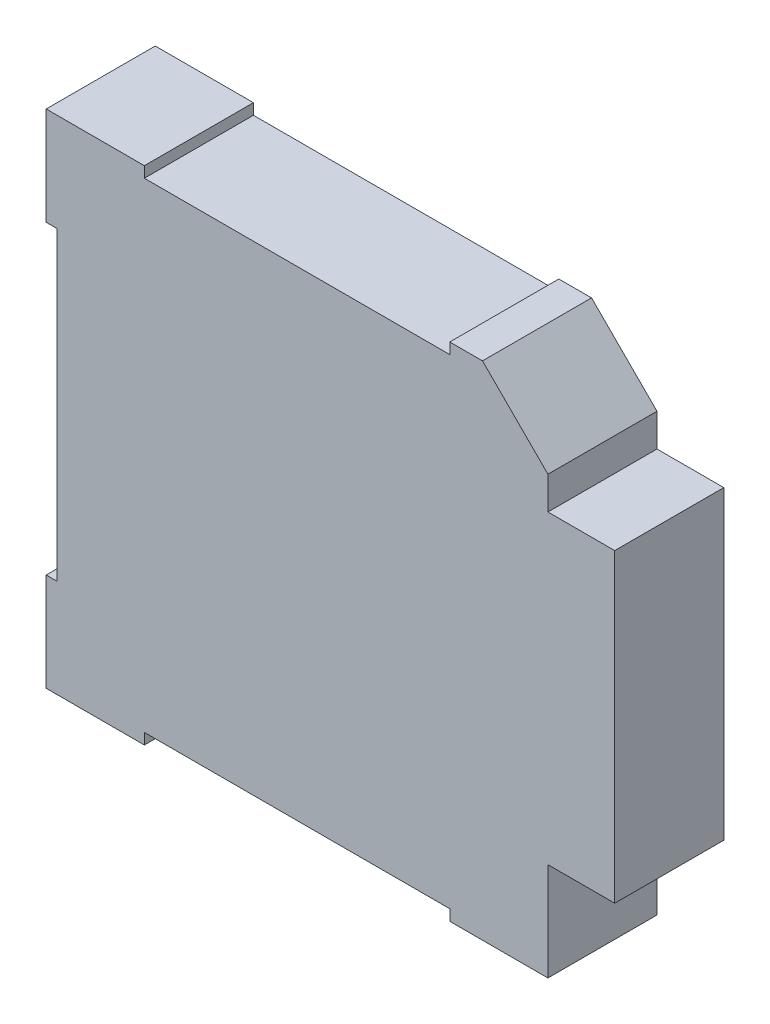
ISO-10303-21;
HEADER;
FILE_DESCRIPTION(('STEP AP214'),'2;1');
FILE_NAME('part.step','',(''),(''),'','','');
FILE_SCHEMA(('AUTOMOTIVE_DESIGN { 1 0 10303 214 1 1 1 1 }'));
ENDSEC;
DATA;
#1=APPLICATION_CONTEXT('core data for automotive mechanical design processes');
#2=APPLICATION_PROTOCOL_DEFINITION('international standard','automotive_design',2000,#1);
#3=PRODUCT_CONTEXT('',#1,'mechanical');
#4=PRODUCT('Part','Part','',(#3));
#5=PRODUCT_RELATED_PRODUCT_CATEGORY('part','',(#4));
#6=PRODUCT_DEFINITION_FORMATION('','',#4);
#7=PRODUCT_DEFINITION_CONTEXT('part definition',#1,'design');
#8=PRODUCT_DEFINITION('design','',#6,#7);
#9=PRODUCT_DEFINITION_SHAPE('','',#8);
#10=(LENGTH_UNIT() NAMED_UNIT(*) SI_UNIT(.MILLI.,.METRE.));
#11=(NAMED_UNIT(*) PLANE_ANGLE_UNIT() SI_UNIT($,.RADIAN.));
#12=(NAMED_UNIT(*) SI_UNIT($,.STERADIAN.) SOLID_ANGLE_UNIT());
#13=UNCERTAINTY_MEASURE_WITH_UNIT(LENGTH_MEASURE(1.E-05),#10,'distance_accuracy_value','');
#14=(GEOMETRIC_REPRESENTATION_CONTEXT(3) GLOBAL_UNCERTAINTY_ASSIGNED_CONTEXT((#13)) GLOBAL_UNIT_ASSIGNED_CONTEXT((#10,
#11,#12)) REPRESENTATION_CONTEXT('',''));
#15=CARTESIAN_POINT('',(0.,0.,0.));
#16=DIRECTION('',(0.,0.,1.));
#17=DIRECTION('',(1.,0.,0.));
#18=AXIS2_PLACEMENT_3D('',#15,#16,#17);
#19=CARTESIAN_POINT('',(2.8,-4.6,2.));
#20=DIRECTION('',(0.,1.,0.));
#21=DIRECTION('',(0.,0.,1.));
#22=AXIS2_PLACEMENT_3D('',#19,#20,#21);
#23=PLANE('',#22);
#24=DIRECTION('',(1.,0.,0.));
#25=VECTOR('',#24,1.);
#26=CARTESIAN_POINT('',(2.8,-4.6,0.));
#27=LINE('',#26,#25);
#28=CARTESIAN_POINT('',(2.8,-4.6,0.));
#29=VERTEX_POINT('',#28);
#30=CARTESIAN_POINT('',(4.6,-4.6,0.));
#31=VERTEX_POINT('',#30);
#32=EDGE_CURVE('E208',#29,#31,#27,.T.);
#33=ORIENTED_EDGE('',*,*,#32,.T.);
#34=DIRECTION('',(0.,0.,-1.));
#35=VECTOR('',#34,1.);
#36=CARTESIAN_POINT('',(4.6,-4.6,2.));
#37=LINE('',#36,#35);
#38=CARTESIAN_POINT('',(4.6,-4.6,2.));
#39=VERTEX_POINT('',#38);
#40=EDGE_CURVE('E11',#39,#31,#37,.T.);
#41=ORIENTED_EDGE('',*,*,#40,.F.);
#42=DIRECTION('',(1.,0.,0.));
#43=VECTOR('',#42,1.);
#44=CARTESIAN_POINT('',(2.8,-4.6,2.));
#45=LINE('',#44,#43);
#46=CARTESIAN_POINT('',(2.8,-4.6,2.));
#47=VERTEX_POINT('',#46);
#48=EDGE_CURVE('E248',#47,#39,#45,.T.);
#49=ORIENTED_EDGE('',*,*,#48,.F.);
#50=DIRECTION('',(0.,0.,-1.));
#51=VECTOR('',#50,1.);
#52=CARTESIAN_POINT('',(2.8,-4.6,2.));
#53=LINE('',#52,#51);
#54=EDGE_CURVE('E204',#47,#29,#53,.T.);
#55=ORIENTED_EDGE('',*,*,#54,.T.);
#56=EDGE_LOOP('',(#33,#41,#49,#55));
#57=FACE_BOUND('',#56,.T.);
#58=ADVANCED_FACE('F34',(#57),#23,.F.);
#59=CARTESIAN_POINT('',(4.6,-4.6,2.));
#60=DIRECTION('',(-1.,0.,0.));
#61=DIRECTION('',(0.,0.,1.));
#62=AXIS2_PLACEMENT_3D('',#59,#60,#61);
#63=PLANE('',#62);
#64=DIRECTION('',(0.,1.,0.));
#65=VECTOR('',#64,1.);
#66=CARTESIAN_POINT('',(4.6,-4.6,0.));
#67=LINE('',#66,#65);
#68=CARTESIAN_POINT('',(4.6,-2.8,0.));
#69=VERTEX_POINT('',#68);
#70=EDGE_CURVE('E211',#31,#69,#67,.T.);
#71=ORIENTED_EDGE('',*,*,#70,.T.);
#72=DIRECTION('',(0.,0.,-1.));
#73=VECTOR('',#72,1.);
#74=CARTESIAN_POINT('',(4.6,-2.8,2.));
#75=LINE('',#74,#73);
#76=CARTESIAN_POINT('',(4.6,-2.8,2.));
#77=VERTEX_POINT('',#76);
#78=EDGE_CURVE('E42',#77,#69,#75,.T.);
#79=ORIENTED_EDGE('',*,*,#78,.F.);
#80=DIRECTION('',(0.,1.,0.));
#81=VECTOR('',#80,1.);
#82=CARTESIAN_POINT('',(4.6,-4.6,2.));
#83=LINE('',#82,#81);
#84=EDGE_CURVE('E132',#39,#77,#83,.T.);
#85=ORIENTED_EDGE('',*,*,#84,.F.);
#86=ORIENTED_EDGE('',*,*,#40,.T.);
#87=EDGE_LOOP('',(#71,#79,#85,#86));
#88=FACE_BOUND('',#87,.T.);
#89=ADVANCED_FACE('F371',(#88),#63,.F.);
#90=CARTESIAN_POINT('',(4.6,-2.8,2.));
#91=DIRECTION('',(0.,1.,0.));
#92=DIRECTION('',(0.,0.,1.));
#93=AXIS2_PLACEMENT_3D('',#90,#91,#92);
#94=PLANE('',#93);
#95=DIRECTION('',(1.,0.,0.));
#96=VECTOR('',#95,1.);
#97=CARTESIAN_POINT('',(4.6,-2.8,0.));
#98=LINE('',#97,#96);
#99=CARTESIAN_POINT('',(5.825,-2.8,0.));
#100=VERTEX_POINT('',#99);
#101=EDGE_CURVE('E213',#69,#100,#98,.T.);
#102=ORIENTED_EDGE('',*,*,#101,.T.);
#103=DIRECTION('',(0.,0.,-1.));
#104=VECTOR('',#103,1.);
#105=CARTESIAN_POINT('',(5.825,-2.8,2.));
#106=LINE('',#105,#104);
#107=CARTESIAN_POINT('',(5.825,-2.8,2.));
#108=VERTEX_POINT('',#107);
#109=EDGE_CURVE('E294',#108,#100,#106,.T.);
#110=ORIENTED_EDGE('',*,*,#109,.F.);
#111=DIRECTION('',(1.,0.,0.));
#112=VECTOR('',#111,1.);
#113=CARTESIAN_POINT('',(4.6,-2.8,2.));
#114=LINE('',#113,#112);
#115=EDGE_CURVE('E302',#77,#108,#114,.T.);
#116=ORIENTED_EDGE('',*,*,#115,.F.);
#117=ORIENTED_EDGE('',*,*,#78,.T.);
#118=EDGE_LOOP('',(#102,#110,#116,#117));
#119=FACE_BOUND('',#118,.T.);
#120=ADVANCED_FACE('F300',(#119),#94,.F.);
#121=CARTESIAN_POINT('',(5.825,-2.8,2.));
#122=DIRECTION('',(-1.,0.,0.));
#123=DIRECTION('',(0.,0.,1.));
#124=AXIS2_PLACEMENT_3D('',#121,#122,#123);
#125=PLANE('',#124);
#126=DIRECTION('',(0.,1.,0.));
#127=VECTOR('',#126,1.);
#128=CARTESIAN_POINT('',(5.825,-2.8,0.));
#129=LINE('',#128,#127);
#130=CARTESIAN_POINT('',(5.825,2.8,0.));
#131=VERTEX_POINT('',#130);
#132=EDGE_CURVE('E215',#100,#131,#129,.T.);
#133=ORIENTED_EDGE('',*,*,#132,.T.);
#134=DIRECTION('',(0.,0.,-1.));
#135=VECTOR('',#134,1.);
#136=CARTESIAN_POINT('',(5.825,2.8,2.));
#137=LINE('',#136,#135);
#138=CARTESIAN_POINT('',(5.825,2.8,2.));
#139=VERTEX_POINT('',#138);
#140=EDGE_CURVE('E291',#139,#131,#137,.T.);
#141=ORIENTED_EDGE('',*,*,#140,.F.);
#142=DIRECTION('',(0.,1.,0.));
#143=VECTOR('',#142,1.);
#144=CARTESIAN_POINT('',(5.825,-2.8,2.));
#145=LINE('',#144,#143);
#146=EDGE_CURVE('E320',#108,#139,#145,.T.);
#147=ORIENTED_EDGE('',*,*,#146,.F.);
#148=ORIENTED_EDGE('',*,*,#109,.T.);
#149=EDGE_LOOP('',(#133,#141,#147,#148));
#150=FACE_BOUND('',#149,.T.);
#151=ADVANCED_FACE('F311',(#150),#125,.F.);
#152=CARTESIAN_POINT('',(5.825,2.8,2.));
#153=DIRECTION('',(0.,-1.,0.));
#154=DIRECTION('',(0.,0.,-1.));
#155=AXIS2_PLACEMENT_3D('',#152,#153,#154);
#156=PLANE('',#155);
#157=DIRECTION('',(-1.,0.,0.));
#158=VECTOR('',#157,1.);
#159=CARTESIAN_POINT('',(5.825,2.8,0.));
#160=LINE('',#159,#158);
#161=CARTESIAN_POINT('',(4.6,2.8,0.));
#162=VERTEX_POINT('',#161);
#163=EDGE_CURVE('E217',#131,#162,#160,.T.);
#164=ORIENTED_EDGE('',*,*,#163,.T.);
#165=DIRECTION('',(0.,0.,-1.));
#166=VECTOR('',#165,1.);
#167=CARTESIAN_POINT('',(4.6,2.8,2.));
#168=LINE('',#167,#166);
#169=CARTESIAN_POINT('',(4.6,2.8,2.));
#170=VERTEX_POINT('',#169);
#171=EDGE_CURVE('E288',#170,#162,#168,.T.);
#172=ORIENTED_EDGE('',*,*,#171,.F.);
#173=DIRECTION('',(-1.,0.,0.));
#174=VECTOR('',#173,1.);
#175=CARTESIAN_POINT('',(5.825,2.8,2.));
#176=LINE('',#175,#174);
#177=EDGE_CURVE('E317',#139,#170,#176,.T.);
#178=ORIENTED_EDGE('',*,*,#177,.F.);
#179=ORIENTED_EDGE('',*,*,#140,.T.);
#180=EDGE_LOOP('',(#164,#172,#178,#179));
#181=FACE_BOUND('',#180,.T.);
#182=ADVANCED_FACE('F315',(#181),#156,.F.);
#183=CARTESIAN_POINT('',(4.6,2.8,2.));
#184=DIRECTION('',(-1.,0.,0.));
#185=DIRECTION('',(0.,0.,1.));
#186=AXIS2_PLACEMENT_3D('',#183,#184,#185);
#187=PLANE('',#186);
#188=DIRECTION('',(0.,1.,0.));
#189=VECTOR('',#188,1.);
#190=CARTESIAN_POINT('',(4.6,2.8,0.));
#191=LINE('',#190,#189);
#192=CARTESIAN_POINT('',(4.6,3.4,0.));
#193=VERTEX_POINT('',#192);
#194=EDGE_CURVE('E219',#162,#193,#191,.T.);
#195=ORIENTED_EDGE('',*,*,#194,.T.);
#196=DIRECTION('',(0.,0.,-1.));
#197=VECTOR('',#196,1.);
#198=CARTESIAN_POINT('',(4.6,3.4,2.));
#199=LINE('',#198,#197);
#200=CARTESIAN_POINT('',(4.6,3.4,2.));
#201=VERTEX_POINT('',#200);
#202=EDGE_CURVE('E285',#201,#193,#199,.T.);
#203=ORIENTED_EDGE('',*,*,#202,.F.);
#204=DIRECTION('',(0.,1.,0.));
#205=VECTOR('',#204,1.);
#206=CARTESIAN_POINT('',(4.6,2.8,2.));
#207=LINE('',#206,#205);
#208=EDGE_CURVE('E319',#170,#201,#207,.T.);
#209=ORIENTED_EDGE('',*,*,#208,.F.);
#210=ORIENTED_EDGE('',*,*,#171,.T.);
#211=EDGE_LOOP('',(#195,#203,#209,#210));
#212=FACE_BOUND('',#211,.T.);
#213=ADVANCED_FACE('F384',(#212),#187,.F.);
#214=CARTESIAN_POINT('',(4.6,3.4,2.));
#215=DIRECTION('',(-0.707106781186547,-0.707106781186547,0.));
#216=DIRECTION('',(0.707106781186548,-0.707106781186548,0.));
#217=AXIS2_PLACEMENT_3D('',#214,#215,#216);
#218=PLANE('',#217);
#219=DIRECTION('',(-0.707106781186547,0.707106781186547,0.));
#220=VECTOR('',#219,1.);
#221=CARTESIAN_POINT('',(4.6,3.4,0.));
#222=LINE('',#221,#220);
#223=CARTESIAN_POINT('',(3.4,4.6,0.));
#224=VERTEX_POINT('',#223);
#225=EDGE_CURVE('E221',#193,#224,#222,.T.);
#226=ORIENTED_EDGE('',*,*,#225,.T.);
#227=DIRECTION('',(0.,0.,-1.));
#228=VECTOR('',#227,1.);
#229=CARTESIAN_POINT('',(3.4,4.6,2.));
#230=LINE('',#229,#228);
#231=CARTESIAN_POINT('',(3.4,4.6,2.));
#232=VERTEX_POINT('',#231);
#233=EDGE_CURVE('E282',#232,#224,#230,.T.);
#234=ORIENTED_EDGE('',*,*,#233,.F.);
#235=DIRECTION('',(-0.707106781186547,0.707106781186547,0.));
#236=VECTOR('',#235,1.);
#237=CARTESIAN_POINT('',(4.6,3.4,2.));
#238=LINE('',#237,#236);
#239=EDGE_CURVE('E322',#201,#232,#238,.T.);
#240=ORIENTED_EDGE('',*,*,#239,.F.);
#241=ORIENTED_EDGE('',*,*,#202,.T.);
#242=EDGE_LOOP('',(#226,#234,#240,#241));
#243=FACE_BOUND('',#242,.T.);
#244=ADVANCED_FACE('F387',(#243),#218,.F.);
#245=CARTESIAN_POINT('',(3.4,4.6,2.));
#246=DIRECTION('',(0.,-1.,0.));
#247=DIRECTION('',(0.,0.,-1.));
#248=AXIS2_PLACEMENT_3D('',#245,#246,#247);
#249=PLANE('',#248);
#250=DIRECTION('',(-1.,0.,0.));
#251=VECTOR('',#250,1.);
#252=CARTESIAN_POINT('',(3.4,4.6,0.));
#253=LINE('',#252,#251);
#254=CARTESIAN_POINT('',(2.8,4.6,0.));
#255=VERTEX_POINT('',#254);
#256=EDGE_CURVE('E223',#224,#255,#253,.T.);
#257=ORIENTED_EDGE('',*,*,#256,.T.);
#258=DIRECTION('',(0.,0.,-1.));
#259=VECTOR('',#258,1.);
#260=CARTESIAN_POINT('',(2.8,4.6,2.));
#261=LINE('',#260,#259);
#262=CARTESIAN_POINT('',(2.8,4.6,2.));
#263=VERTEX_POINT('',#262);
#264=EDGE_CURVE('E279',#263,#255,#261,.T.);
#265=ORIENTED_EDGE('',*,*,#264,.F.);
#266=DIRECTION('',(-1.,0.,0.));
#267=VECTOR('',#266,1.);
#268=CARTESIAN_POINT('',(3.4,4.6,2.));
#269=LINE('',#268,#267);
#270=EDGE_CURVE('E328',#232,#263,#269,.T.);
#271=ORIENTED_EDGE('',*,*,#270,.F.);
#272=ORIENTED_EDGE('',*,*,#233,.T.);
#273=EDGE_LOOP('',(#257,#265,#271,#272));
#274=FACE_BOUND('',#273,.T.);
#275=ADVANCED_FACE('F391',(#274),#249,.F.);
#276=CARTESIAN_POINT('',(2.8,4.6,2.));
#277=DIRECTION('',(1.,0.,0.));
#278=DIRECTION('',(0.,0.,-1.));
#279=AXIS2_PLACEMENT_3D('',#276,#277,#278);
#280=PLANE('',#279);
#281=DIRECTION('',(0.,-1.,0.));
#282=VECTOR('',#281,1.);
#283=CARTESIAN_POINT('',(2.8,4.6,0.));
#284=LINE('',#283,#282);
#285=CARTESIAN_POINT('',(2.8,4.4,0.));
#286=VERTEX_POINT('',#285);
#287=EDGE_CURVE('E225',#255,#286,#284,.T.);
#288=ORIENTED_EDGE('',*,*,#287,.T.);
#289=DIRECTION('',(0.,0.,-1.));
#290=VECTOR('',#289,1.);
#291=CARTESIAN_POINT('',(2.8,4.4,2.));
#292=LINE('',#291,#290);
#293=CARTESIAN_POINT('',(2.8,4.4,2.));
#294=VERTEX_POINT('',#293);
#295=EDGE_CURVE('E276',#294,#286,#292,.T.);
#296=ORIENTED_EDGE('',*,*,#295,.F.);
#297=DIRECTION('',(0.,-1.,0.));
#298=VECTOR('',#297,1.);
#299=CARTESIAN_POINT('',(2.8,4.6,2.));
#300=LINE('',#299,#298);
#301=EDGE_CURVE('E330',#263,#294,#300,.T.);
#302=ORIENTED_EDGE('',*,*,#301,.F.);
#303=ORIENTED_EDGE('',*,*,#264,.T.);
#304=EDGE_LOOP('',(#288,#296,#302,#303));
#305=FACE_BOUND('',#304,.T.);
#306=ADVANCED_FACE('F395',(#305),#280,.F.);
#307=CARTESIAN_POINT('',(2.8,4.4,2.));
#308=DIRECTION('',(0.,-1.,0.));
#309=DIRECTION('',(0.,0.,-1.));
#310=AXIS2_PLACEMENT_3D('',#307,#308,#309);
#311=PLANE('',#310);
#312=DIRECTION('',(-1.,0.,0.));
#313=VECTOR('',#312,1.);
#314=CARTESIAN_POINT('',(2.8,4.4,0.));
#315=LINE('',#314,#313);
#316=CARTESIAN_POINT('',(-2.8,4.4,0.));
#317=VERTEX_POINT('',#316);
#318=EDGE_CURVE('E227',#286,#317,#315,.T.);
#319=ORIENTED_EDGE('',*,*,#318,.T.);
#320=DIRECTION('',(0.,0.,-1.));
#321=VECTOR('',#320,1.);
#322=CARTESIAN_POINT('',(-2.8,4.4,2.));
#323=LINE('',#322,#321);
#324=CARTESIAN_POINT('',(-2.8,4.4,2.));
#325=VERTEX_POINT('',#324);
#326=EDGE_CURVE('E273',#325,#317,#323,.T.);
#327=ORIENTED_EDGE('',*,*,#326,.F.);
#328=DIRECTION('',(-1.,0.,0.));
#329=VECTOR('',#328,1.);
#330=CARTESIAN_POINT('',(2.8,4.4,2.));
#331=LINE('',#330,#329);
#332=EDGE_CURVE('E332',#294,#325,#331,.T.);
#333=ORIENTED_EDGE('',*,*,#332,.F.);
#334=ORIENTED_EDGE('',*,*,#295,.T.);
#335=EDGE_LOOP('',(#319,#327,#333,#334));
#336=FACE_BOUND('',#335,.T.);
#337=ADVANCED_FACE('F399',(#336),#311,.F.);
#338=CARTESIAN_POINT('',(-2.8,4.4,2.));
#339=DIRECTION('',(-1.,0.,0.));
#340=DIRECTION('',(0.,0.,1.));
#341=AXIS2_PLACEMENT_3D('',#338,#339,#340);
#342=PLANE('',#341);
#343=DIRECTION('',(0.,1.,0.));
#344=VECTOR('',#343,1.);
#345=CARTESIAN_POINT('',(-2.8,4.4,0.));
#346=LINE('',#345,#344);
#347=CARTESIAN_POINT('',(-2.8,4.6,0.));
#348=VERTEX_POINT('',#347);
#349=EDGE_CURVE('E229',#317,#348,#346,.T.);
#350=ORIENTED_EDGE('',*,*,#349,.T.);
#351=DIRECTION('',(0.,0.,-1.));
#352=VECTOR('',#351,1.);
#353=CARTESIAN_POINT('',(-2.8,4.6,2.));
#354=LINE('',#353,#352);
#355=CARTESIAN_POINT('',(-2.8,4.6,2.));
#356=VERTEX_POINT('',#355);
#357=EDGE_CURVE('E270',#356,#348,#354,.T.);
#358=ORIENTED_EDGE('',*,*,#357,.F.);
#359=DIRECTION('',(0.,1.,0.));
#360=VECTOR('',#359,1.);
#361=CARTESIAN_POINT('',(-2.8,4.4,2.));
#362=LINE('',#361,#360);
#363=EDGE_CURVE('E334',#325,#356,#362,.T.);
#364=ORIENTED_EDGE('',*,*,#363,.F.);
#365=ORIENTED_EDGE('',*,*,#326,.T.);
#366=EDGE_LOOP('',(#350,#358,#364,#365));
#367=FACE_BOUND('',#366,.T.);
#368=ADVANCED_FACE('F403',(#367),#342,.F.);
#369=CARTESIAN_POINT('',(-2.8,4.6,2.));
#370=DIRECTION('',(0.,-1.,0.));
#371=DIRECTION('',(0.,0.,-1.));
#372=AXIS2_PLACEMENT_3D('',#369,#370,#371);
#373=PLANE('',#372);
#374=DIRECTION('',(-1.,0.,0.));
#375=VECTOR('',#374,1.);
#376=CARTESIAN_POINT('',(-2.8,4.6,0.));
#377=LINE('',#376,#375);
#378=CARTESIAN_POINT('',(-4.6,4.6,0.));
#379=VERTEX_POINT('',#378);
#380=EDGE_CURVE('E231',#348,#379,#377,.T.);
#381=ORIENTED_EDGE('',*,*,#380,.T.);
#382=DIRECTION('',(0.,0.,-1.));
#383=VECTOR('',#382,1.);
#384=CARTESIAN_POINT('',(-4.6,4.6,2.));
#385=LINE('',#384,#383);
#386=CARTESIAN_POINT('',(-4.6,4.6,2.));
#387=VERTEX_POINT('',#386);
#388=EDGE_CURVE('E267',#387,#379,#385,.T.);
#389=ORIENTED_EDGE('',*,*,#388,.F.);
#390=DIRECTION('',(-1.,0.,0.));
#391=VECTOR('',#390,1.);
#392=CARTESIAN_POINT('',(-2.8,4.6,2.));
#393=LINE('',#392,#391);
#394=EDGE_CURVE('E336',#356,#387,#393,.T.);
#395=ORIENTED_EDGE('',*,*,#394,.F.);
#396=ORIENTED_EDGE('',*,*,#357,.T.);
#397=EDGE_LOOP('',(#381,#389,#395,#396));
#398=FACE_BOUND('',#397,.T.);
#399=ADVANCED_FACE('F407',(#398),#373,.F.);
#400=CARTESIAN_POINT('',(-4.6,4.6,2.));
#401=DIRECTION('',(1.,0.,0.));
#402=DIRECTION('',(0.,0.,-1.));
#403=AXIS2_PLACEMENT_3D('',#400,#401,#402);
#404=PLANE('',#403);
#405=DIRECTION('',(0.,-1.,0.));
#406=VECTOR('',#405,1.);
#407=CARTESIAN_POINT('',(-4.6,4.6,0.));
#408=LINE('',#407,#406);
#409=CARTESIAN_POINT('',(-4.6,2.8,0.));
#410=VERTEX_POINT('',#409);
#411=EDGE_CURVE('E233',#379,#410,#408,.T.);
#412=ORIENTED_EDGE('',*,*,#411,.T.);
#413=DIRECTION('',(0.,0.,-1.));
#414=VECTOR('',#413,1.);
#415=CARTESIAN_POINT('',(-4.6,2.8,2.));
#416=LINE('',#415,#414);
#417=CARTESIAN_POINT('',(-4.6,2.8,2.));
#418=VERTEX_POINT('',#417);
#419=EDGE_CURVE('E264',#418,#410,#416,.T.);
#420=ORIENTED_EDGE('',*,*,#419,.F.);
#421=DIRECTION('',(0.,-1.,0.));
#422=VECTOR('',#421,1.);
#423=CARTESIAN_POINT('',(-4.6,4.6,2.));
#424=LINE('',#423,#422);
#425=EDGE_CURVE('E338',#387,#418,#424,.T.);
#426=ORIENTED_EDGE('',*,*,#425,.F.);
#427=ORIENTED_EDGE('',*,*,#388,.T.);
#428=EDGE_LOOP('',(#412,#420,#426,#427));
#429=FACE_BOUND('',#428,.T.);
#430=ADVANCED_FACE('F411',(#429),#404,.F.);
#431=CARTESIAN_POINT('',(-4.6,2.8,2.));
#432=DIRECTION('',(0.,1.,0.));
#433=DIRECTION('',(0.,0.,1.));
#434=AXIS2_PLACEMENT_3D('',#431,#432,#433);
#435=PLANE('',#434);
#436=DIRECTION('',(1.,0.,0.));
#437=VECTOR('',#436,1.);
#438=CARTESIAN_POINT('',(-4.6,2.8,0.));
#439=LINE('',#438,#437);
#440=CARTESIAN_POINT('',(-4.4,2.8,0.));
#441=VERTEX_POINT('',#440);
#442=EDGE_CURVE('E235',#410,#441,#439,.T.);
#443=ORIENTED_EDGE('',*,*,#442,.T.);
#444=DIRECTION('',(0.,0.,-1.));
#445=VECTOR('',#444,1.);
#446=CARTESIAN_POINT('',(-4.4,2.8,2.));
#447=LINE('',#446,#445);
#448=CARTESIAN_POINT('',(-4.4,2.8,2.));
#449=VERTEX_POINT('',#448);
#450=EDGE_CURVE('E261',#449,#441,#447,.T.);
#451=ORIENTED_EDGE('',*,*,#450,.F.);
#452=DIRECTION('',(1.,0.,0.));
#453=VECTOR('',#452,1.);
#454=CARTESIAN_POINT('',(-4.6,2.8,2.));
#455=LINE('',#454,#453);
#456=EDGE_CURVE('E340',#418,#449,#455,.T.);
#457=ORIENTED_EDGE('',*,*,#456,.F.);
#458=ORIENTED_EDGE('',*,*,#419,.T.);
#459=EDGE_LOOP('',(#443,#451,#457,#458));
#460=FACE_BOUND('',#459,.T.);
#461=ADVANCED_FACE('F415',(#460),#435,.F.);
#462=CARTESIAN_POINT('',(-4.4,2.8,2.));
#463=DIRECTION('',(1.,0.,0.));
#464=DIRECTION('',(0.,0.,-1.));
#465=AXIS2_PLACEMENT_3D('',#462,#463,#464);
#466=PLANE('',#465);
#467=DIRECTION('',(0.,-1.,0.));
#468=VECTOR('',#467,1.);
#469=CARTESIAN_POINT('',(-4.4,2.8,0.));
#470=LINE('',#469,#468);
#471=CARTESIAN_POINT('',(-4.4,-2.8,0.));
#472=VERTEX_POINT('',#471);
#473=EDGE_CURVE('E237',#441,#472,#470,.T.);
#474=ORIENTED_EDGE('',*,*,#473,.T.);
#475=DIRECTION('',(0.,0.,-1.));
#476=VECTOR('',#475,1.);
#477=CARTESIAN_POINT('',(-4.4,-2.8,2.));
#478=LINE('',#477,#476);
#479=CARTESIAN_POINT('',(-4.4,-2.8,2.));
#480=VERTEX_POINT('',#479);
#481=EDGE_CURVE('E258',#480,#472,#478,.T.);
#482=ORIENTED_EDGE('',*,*,#481,.F.);
#483=DIRECTION('',(0.,-1.,0.));
#484=VECTOR('',#483,1.);
#485=CARTESIAN_POINT('',(-4.4,2.8,2.));
#486=LINE('',#485,#484);
#487=EDGE_CURVE('E342',#449,#480,#486,.T.);
#488=ORIENTED_EDGE('',*,*,#487,.F.);
#489=ORIENTED_EDGE('',*,*,#450,.T.);
#490=EDGE_LOOP('',(#474,#482,#488,#489));
#491=FACE_BOUND('',#490,.T.);
#492=ADVANCED_FACE('F419',(#491),#466,.F.);
#493=CARTESIAN_POINT('',(-4.4,-2.8,2.));
#494=DIRECTION('',(0.,-1.,0.));
#495=DIRECTION('',(0.,0.,-1.));
#496=AXIS2_PLACEMENT_3D('',#493,#494,#495);
#497=PLANE('',#496);
#498=DIRECTION('',(-1.,0.,0.));
#499=VECTOR('',#498,1.);
#500=CARTESIAN_POINT('',(-4.4,-2.8,0.));
#501=LINE('',#500,#499);
#502=CARTESIAN_POINT('',(-4.6,-2.8,0.));
#503=VERTEX_POINT('',#502);
#504=EDGE_CURVE('E239',#472,#503,#501,.T.);
#505=ORIENTED_EDGE('',*,*,#504,.T.);
#506=DIRECTION('',(0.,0.,-1.));
#507=VECTOR('',#506,1.);
#508=CARTESIAN_POINT('',(-4.6,-2.8,2.));
#509=LINE('',#508,#507);
#510=CARTESIAN_POINT('',(-4.6,-2.8,2.));
#511=VERTEX_POINT('',#510);
#512=EDGE_CURVE('E255',#511,#503,#509,.T.);
#513=ORIENTED_EDGE('',*,*,#512,.F.);
#514=DIRECTION('',(-1.,0.,0.));
#515=VECTOR('',#514,1.);
#516=CARTESIAN_POINT('',(-4.4,-2.8,2.));
#517=LINE('',#516,#515);
#518=EDGE_CURVE('E344',#480,#511,#517,.T.);
#519=ORIENTED_EDGE('',*,*,#518,.F.);
#520=ORIENTED_EDGE('',*,*,#481,.T.);
#521=EDGE_LOOP('',(#505,#513,#519,#520));
#522=FACE_BOUND('',#521,.T.);
#523=ADVANCED_FACE('F423',(#522),#497,.F.);
#524=CARTESIAN_POINT('',(-4.6,-2.8,2.));
#525=DIRECTION('',(1.,0.,0.));
#526=DIRECTION('',(0.,0.,-1.));
#527=AXIS2_PLACEMENT_3D('',#524,#525,#526);
#528=PLANE('',#527);
#529=DIRECTION('',(0.,-1.,0.));
#530=VECTOR('',#529,1.);
#531=CARTESIAN_POINT('',(-4.6,-2.8,0.));
#532=LINE('',#531,#530);
#533=CARTESIAN_POINT('',(-4.6,-4.6,0.));
#534=VERTEX_POINT('',#533);
#535=EDGE_CURVE('E241',#503,#534,#532,.T.);
#536=ORIENTED_EDGE('',*,*,#535,.T.);
#537=DIRECTION('',(0.,0.,-1.));
#538=VECTOR('',#537,1.);
#539=CARTESIAN_POINT('',(-4.6,-4.6,2.));
#540=LINE('',#539,#538);
#541=CARTESIAN_POINT('',(-4.6,-4.6,2.));
#542=VERTEX_POINT('',#541);
#543=EDGE_CURVE('E252',#542,#534,#540,.T.);
#544=ORIENTED_EDGE('',*,*,#543,.F.);
#545=DIRECTION('',(0.,-1.,0.));
#546=VECTOR('',#545,1.);
#547=CARTESIAN_POINT('',(-4.6,-2.8,2.));
#548=LINE('',#547,#546);
#549=EDGE_CURVE('E346',#511,#542,#548,.T.);
#550=ORIENTED_EDGE('',*,*,#549,.F.);
#551=ORIENTED_EDGE('',*,*,#512,.T.);
#552=EDGE_LOOP('',(#536,#544,#550,#551));
#553=FACE_BOUND('',#552,.T.);
#554=ADVANCED_FACE('F352',(#553),#528,.F.);
#555=CARTESIAN_POINT('',(-4.6,-4.6,2.));
#556=DIRECTION('',(0.,1.,0.));
#557=DIRECTION('',(0.,0.,1.));
#558=AXIS2_PLACEMENT_3D('',#555,#556,#557);
#559=PLANE('',#558);
#560=DIRECTION('',(1.,0.,0.));
#561=VECTOR('',#560,1.);
#562=CARTESIAN_POINT('',(-4.6,-4.6,0.));
#563=LINE('',#562,#561);
#564=CARTESIAN_POINT('',(-2.8,-4.6,0.));
#565=VERTEX_POINT('',#564);
#566=EDGE_CURVE('E243',#534,#565,#563,.T.);
#567=ORIENTED_EDGE('',*,*,#566,.T.);
#568=DIRECTION('',(0.,0.,-1.));
#569=VECTOR('',#568,1.);
#570=CARTESIAN_POINT('',(-2.8,-4.6,2.));
#571=LINE('',#570,#569);
#572=CARTESIAN_POINT('',(-2.8,-4.6,2.));
#573=VERTEX_POINT('',#572);
#574=EDGE_CURVE('E199',#573,#565,#571,.T.);
#575=ORIENTED_EDGE('',*,*,#574,.F.);
#576=DIRECTION('',(1.,0.,0.));
#577=VECTOR('',#576,1.);
#578=CARTESIAN_POINT('',(-4.6,-4.6,2.));
#579=LINE('',#578,#577);
#580=EDGE_CURVE('E190',#542,#573,#579,.T.);
#581=ORIENTED_EDGE('',*,*,#580,.F.);
#582=ORIENTED_EDGE('',*,*,#543,.T.);
#583=EDGE_LOOP('',(#567,#575,#581,#582));
#584=FACE_BOUND('',#583,.T.);
#585=ADVANCED_FACE('F356',(#584),#559,.F.);
#586=CARTESIAN_POINT('',(-2.8,-4.6,2.));
#587=DIRECTION('',(-1.,0.,0.));
#588=DIRECTION('',(0.,0.,1.));
#589=AXIS2_PLACEMENT_3D('',#586,#587,#588);
#590=PLANE('',#589);
#591=DIRECTION('',(0.,1.,0.));
#592=VECTOR('',#591,1.);
#593=CARTESIAN_POINT('',(-2.8,-4.6,0.));
#594=LINE('',#593,#592);
#595=CARTESIAN_POINT('',(-2.8,-4.4,0.));
#596=VERTEX_POINT('',#595);
#597=EDGE_CURVE('E198',#565,#596,#594,.T.);
#598=ORIENTED_EDGE('',*,*,#597,.T.);
#599=DIRECTION('',(0.,0.,-1.));
#600=VECTOR('',#599,1.);
#601=CARTESIAN_POINT('',(-2.8,-4.4,2.));
#602=LINE('',#601,#600);
#603=CARTESIAN_POINT('',(-2.8,-4.4,2.));
#604=VERTEX_POINT('',#603);
#605=EDGE_CURVE('E195',#604,#596,#602,.T.);
#606=ORIENTED_EDGE('',*,*,#605,.F.);
#607=DIRECTION('',(0.,1.,0.));
#608=VECTOR('',#607,1.);
#609=CARTESIAN_POINT('',(-2.8,-4.6,2.));
#610=LINE('',#609,#608);
#611=EDGE_CURVE('E184',#573,#604,#610,.T.);
#612=ORIENTED_EDGE('',*,*,#611,.F.);
#613=ORIENTED_EDGE('',*,*,#574,.T.);
#614=EDGE_LOOP('',(#598,#606,#612,#613));
#615=FACE_BOUND('',#614,.T.);
#616=ADVANCED_FACE('F196',(#615),#590,.F.);
#617=CARTESIAN_POINT('',(-2.8,-4.4,2.));
#618=DIRECTION('',(0.,1.,0.));
#619=DIRECTION('',(0.,0.,1.));
#620=AXIS2_PLACEMENT_3D('',#617,#618,#619);
#621=PLANE('',#620);
#622=DIRECTION('',(1.,0.,0.));
#623=VECTOR('',#622,1.);
#624=CARTESIAN_POINT('',(-2.8,-4.4,0.));
#625=LINE('',#624,#623);
#626=CARTESIAN_POINT('',(2.8,-4.4,0.));
#627=VERTEX_POINT('',#626);
#628=EDGE_CURVE('E118',#596,#627,#625,.T.);
#629=ORIENTED_EDGE('',*,*,#628,.T.);
#630=DIRECTION('',(0.,0.,-1.));
#631=VECTOR('',#630,1.);
#632=CARTESIAN_POINT('',(2.8,-4.4,2.));
#633=LINE('',#632,#631);
#634=CARTESIAN_POINT('',(2.8,-4.4,2.));
#635=VERTEX_POINT('',#634);
#636=EDGE_CURVE('E200',#635,#627,#633,.T.);
#637=ORIENTED_EDGE('',*,*,#636,.F.);
#638=DIRECTION('',(1.,0.,0.));
#639=VECTOR('',#638,1.);
#640=CARTESIAN_POINT('',(-2.8,-4.4,2.));
#641=LINE('',#640,#639);
#642=EDGE_CURVE('E188',#604,#635,#641,.T.);
#643=ORIENTED_EDGE('',*,*,#642,.F.);
#644=ORIENTED_EDGE('',*,*,#605,.T.);
#645=EDGE_LOOP('',(#629,#637,#643,#644));
#646=FACE_BOUND('',#645,.T.);
#647=ADVANCED_FACE('F202',(#646),#621,.F.);
#648=CARTESIAN_POINT('',(2.8,-4.4,2.));
#649=DIRECTION('',(1.,0.,0.));
#650=DIRECTION('',(0.,0.,-1.));
#651=AXIS2_PLACEMENT_3D('',#648,#649,#650);
#652=PLANE('',#651);
#653=DIRECTION('',(0.,-1.,0.));
#654=VECTOR('',#653,1.);
#655=CARTESIAN_POINT('',(2.8,-4.4,0.));
#656=LINE('',#655,#654);
#657=EDGE_CURVE('E124',#627,#29,#656,.T.);
#658=ORIENTED_EDGE('',*,*,#657,.T.);
#659=ORIENTED_EDGE('',*,*,#54,.F.);
#660=DIRECTION('',(0.,-1.,0.));
#661=VECTOR('',#660,1.);
#662=CARTESIAN_POINT('',(2.8,-4.4,2.));
#663=LINE('',#662,#661);
#664=EDGE_CURVE('E50',#635,#47,#663,.T.);
#665=ORIENTED_EDGE('',*,*,#664,.F.);
#666=ORIENTED_EDGE('',*,*,#636,.T.);
#667=EDGE_LOOP('',(#658,#659,#665,#666));
#668=FACE_BOUND('',#667,.T.);
#669=ADVANCED_FACE('F360',(#668),#652,.F.);
#670=CARTESIAN_POINT('',(0.,0.,2.));
#671=DIRECTION('',(0.,0.,1.));
#672=DIRECTION('',(1.,0.,0.));
#673=AXIS2_PLACEMENT_3D('',#670,#671,#672);
#674=PLANE('',#673);
#675=ORIENTED_EDGE('',*,*,#48,.T.);
#676=ORIENTED_EDGE('',*,*,#84,.T.);
#677=ORIENTED_EDGE('',*,*,#115,.T.);
#678=ORIENTED_EDGE('',*,*,#146,.T.);
#679=ORIENTED_EDGE('',*,*,#177,.T.);
#680=ORIENTED_EDGE('',*,*,#208,.T.);
#681=ORIENTED_EDGE('',*,*,#239,.T.);
#682=ORIENTED_EDGE('',*,*,#270,.T.);
#683=ORIENTED_EDGE('',*,*,#301,.T.);
#684=ORIENTED_EDGE('',*,*,#332,.T.);
#685=ORIENTED_EDGE('',*,*,#363,.T.);
#686=ORIENTED_EDGE('',*,*,#394,.T.);
#687=ORIENTED_EDGE('',*,*,#425,.T.);
#688=ORIENTED_EDGE('',*,*,#456,.T.);
#689=ORIENTED_EDGE('',*,*,#487,.T.);
#690=ORIENTED_EDGE('',*,*,#518,.T.);
#691=ORIENTED_EDGE('',*,*,#549,.T.);
#692=ORIENTED_EDGE('',*,*,#580,.T.);
#693=ORIENTED_EDGE('',*,*,#611,.T.);
#694=ORIENTED_EDGE('',*,*,#642,.T.);
#695=ORIENTED_EDGE('',*,*,#664,.T.);
#696=EDGE_LOOP('',(#675,#676,#677,#678,#679,#680,#681,#682,#683,#684,#685,#686,#687,#688,#689,
#690,#691,#692,#693,#694,#695));
#697=FACE_BOUND('',#696,.T.);
#698=ADVANCED_FACE('F186',(#697),#674,.T.);
#699=CARTESIAN_POINT('',(0.,0.,0.));
#700=DIRECTION('',(0.,0.,1.));
#701=DIRECTION('',(1.,0.,0.));
#702=AXIS2_PLACEMENT_3D('',#699,#700,#701);
#703=PLANE('',#702);
#704=ORIENTED_EDGE('',*,*,#32,.F.);
#705=ORIENTED_EDGE('',*,*,#657,.F.);
#706=ORIENTED_EDGE('',*,*,#628,.F.);
#707=ORIENTED_EDGE('',*,*,#597,.F.);
#708=ORIENTED_EDGE('',*,*,#566,.F.);
#709=ORIENTED_EDGE('',*,*,#535,.F.);
#710=ORIENTED_EDGE('',*,*,#504,.F.);
#711=ORIENTED_EDGE('',*,*,#473,.F.);
#712=ORIENTED_EDGE('',*,*,#442,.F.);
#713=ORIENTED_EDGE('',*,*,#411,.F.);
#714=ORIENTED_EDGE('',*,*,#380,.F.);
#715=ORIENTED_EDGE('',*,*,#349,.F.);
#716=ORIENTED_EDGE('',*,*,#318,.F.);
#717=ORIENTED_EDGE('',*,*,#287,.F.);
#718=ORIENTED_EDGE('',*,*,#256,.F.);
#719=ORIENTED_EDGE('',*,*,#225,.F.);
#720=ORIENTED_EDGE('',*,*,#194,.F.);
#721=ORIENTED_EDGE('',*,*,#163,.F.);
#722=ORIENTED_EDGE('',*,*,#132,.F.);
#723=ORIENTED_EDGE('',*,*,#101,.F.);
#724=ORIENTED_EDGE('',*,*,#70,.F.);
#725=EDGE_LOOP('',(#704,#705,#706,#707,#708,#709,#710,#711,#712,#713,#714,#715,#716,#717,#718,
#719,#720,#721,#722,#723,#724));
#726=FACE_BOUND('',#725,.T.);
#727=ADVANCED_FACE('F306',(#726),#703,.F.);
#728=CLOSED_SHELL('',(#58,#89,#120,#151,#182,#213,#244,#275,#306,#337,#368,#399,#430,#461,#492,
#523,#554,#585,#616,#647,#669,#698,#727));
#729=MANIFOLD_SOLID_BREP('B2',#728);
#730=ADVANCED_BREP_SHAPE_REPRESENTATION('',(#18,#729),#14);
#731=SHAPE_DEFINITION_REPRESENTATION(#9,#730);
ENDSEC;
END-ISO-10303-21;
